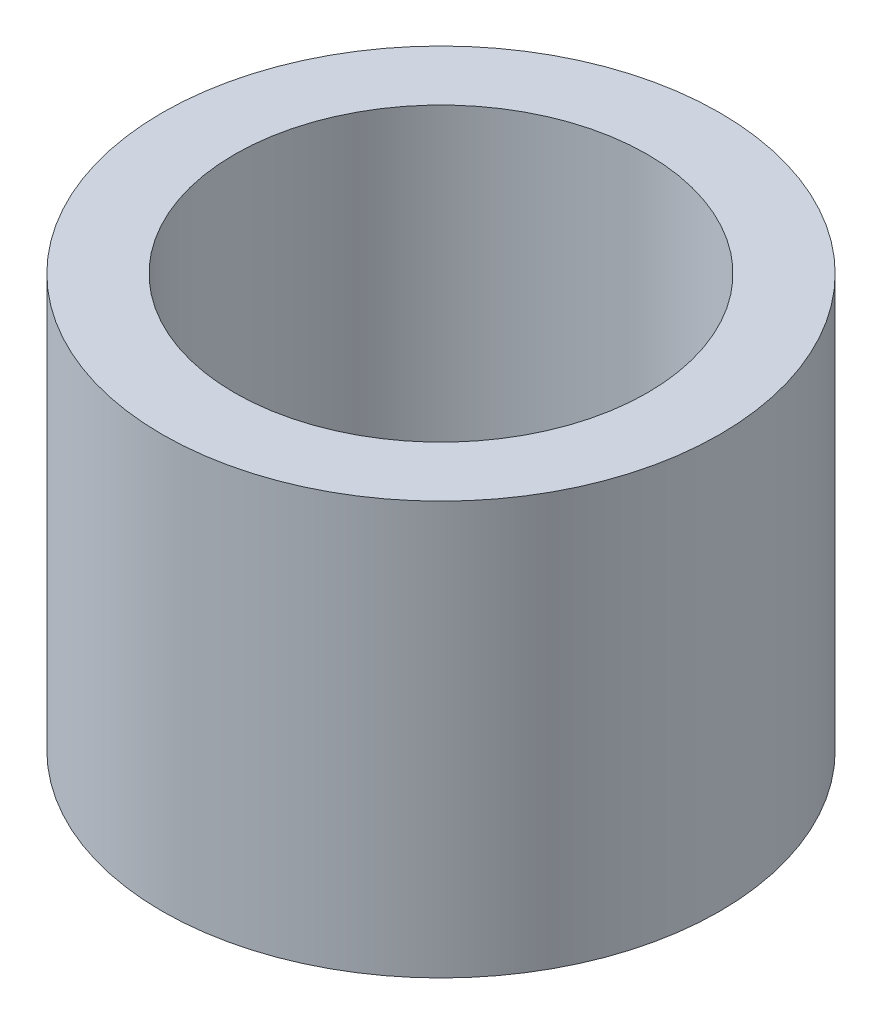
ISO-10303-21;
HEADER;
FILE_DESCRIPTION(('STEP AP214'),'2;1');
FILE_NAME('part.step','',(''),(''),'','','');
FILE_SCHEMA(('AUTOMOTIVE_DESIGN { 1 0 10303 214 1 1 1 1 }'));
ENDSEC;
DATA;
#1=APPLICATION_CONTEXT('core data for automotive mechanical design processes');
#2=APPLICATION_PROTOCOL_DEFINITION('international standard','automotive_design',2000,#1);
#3=PRODUCT_CONTEXT('',#1,'mechanical');
#4=PRODUCT('Part','Part','',(#3));
#5=PRODUCT_RELATED_PRODUCT_CATEGORY('part','',(#4));
#6=PRODUCT_DEFINITION_FORMATION('','',#4);
#7=PRODUCT_DEFINITION_CONTEXT('part definition',#1,'design');
#8=PRODUCT_DEFINITION('design','',#6,#7);
#9=PRODUCT_DEFINITION_SHAPE('','',#8);
#10=(LENGTH_UNIT() NAMED_UNIT(*) SI_UNIT(.MILLI.,.METRE.));
#11=(NAMED_UNIT(*) PLANE_ANGLE_UNIT() SI_UNIT($,.RADIAN.));
#12=(NAMED_UNIT(*) SI_UNIT($,.STERADIAN.) SOLID_ANGLE_UNIT());
#13=UNCERTAINTY_MEASURE_WITH_UNIT(LENGTH_MEASURE(1.E-05),#10,'distance_accuracy_value','');
#14=(GEOMETRIC_REPRESENTATION_CONTEXT(3) GLOBAL_UNCERTAINTY_ASSIGNED_CONTEXT((#13)) GLOBAL_UNIT_ASSIGNED_CONTEXT((#10,
#11,#12)) REPRESENTATION_CONTEXT('',''));
#15=CARTESIAN_POINT('',(0.,0.,0.));
#16=DIRECTION('',(0.,0.,1.));
#17=DIRECTION('',(1.,0.,0.));
#18=AXIS2_PLACEMENT_3D('',#15,#16,#17);
#19=CARTESIAN_POINT('',(0.,2.,0.));
#20=DIRECTION('',(0.,1.,0.));
#21=DIRECTION('',(0.,0.,1.));
#22=AXIS2_PLACEMENT_3D('',#19,#20,#21);
#23=PLANE('',#22);
#24=CARTESIAN_POINT('',(0.,2.,0.));
#25=DIRECTION('',(0.,1.,0.));
#26=DIRECTION('',(0.,0.,1.));
#27=AXIS2_PLACEMENT_3D('',#24,#25,#26);
#28=CIRCLE('',#27,1.35);
#29=CARTESIAN_POINT('',(0.,2.,1.35));
#30=VERTEX_POINT('',#29);
#31=EDGE_CURVE('E10',#30,#30,#28,.T.);
#32=ORIENTED_EDGE('',*,*,#31,.T.);
#33=EDGE_LOOP('',(#32));
#34=FACE_BOUND('',#33,.T.);
#35=CARTESIAN_POINT('',(0.,2.,0.));
#36=DIRECTION('',(0.,1.,0.));
#37=DIRECTION('',(0.,0.,1.));
#38=AXIS2_PLACEMENT_3D('',#35,#36,#37);
#39=CIRCLE('',#38,1.);
#40=CARTESIAN_POINT('',(0.,2.,1.));
#41=VERTEX_POINT('',#40);
#42=EDGE_CURVE('E48',#41,#41,#39,.T.);
#43=ORIENTED_EDGE('',*,*,#42,.F.);
#44=EDGE_LOOP('',(#43));
#45=FACE_BOUND('',#44,.T.);
#46=ADVANCED_FACE('F40',(#34,#45),#23,.T.);
#47=CARTESIAN_POINT('',(0.,0.,0.));
#48=DIRECTION('',(0.,1.,0.));
#49=DIRECTION('',(0.,0.,1.));
#50=AXIS2_PLACEMENT_3D('',#47,#48,#49);
#51=PLANE('',#50);
#52=CARTESIAN_POINT('',(0.,0.,0.));
#53=DIRECTION('',(0.,1.,0.));
#54=DIRECTION('',(0.,0.,1.));
#55=AXIS2_PLACEMENT_3D('',#52,#53,#54);
#56=CIRCLE('',#55,1.35);
#57=CARTESIAN_POINT('',(0.,0.,1.35));
#58=VERTEX_POINT('',#57);
#59=EDGE_CURVE('E41',#58,#58,#56,.T.);
#60=ORIENTED_EDGE('',*,*,#59,.F.);
#61=EDGE_LOOP('',(#60));
#62=FACE_BOUND('',#61,.T.);
#63=CARTESIAN_POINT('',(0.,0.,0.));
#64=DIRECTION('',(0.,1.,0.));
#65=DIRECTION('',(0.,0.,1.));
#66=AXIS2_PLACEMENT_3D('',#63,#64,#65);
#67=CIRCLE('',#66,1.);
#68=CARTESIAN_POINT('',(0.,0.,1.));
#69=VERTEX_POINT('',#68);
#70=EDGE_CURVE('E49',#69,#69,#67,.T.);
#71=ORIENTED_EDGE('',*,*,#70,.T.);
#72=EDGE_LOOP('',(#71));
#73=FACE_BOUND('',#72,.T.);
#74=ADVANCED_FACE('F58',(#62,#73),#51,.F.);
#75=CARTESIAN_POINT('',(0.,2.,0.));
#76=DIRECTION('',(0.,-1.,0.));
#77=DIRECTION('',(0.,0.,-1.));
#78=AXIS2_PLACEMENT_3D('',#75,#76,#77);
#79=CYLINDRICAL_SURFACE('',#78,1.35);
#80=ORIENTED_EDGE('',*,*,#31,.F.);
#81=EDGE_LOOP('',(#80));
#82=FACE_BOUND('',#81,.T.);
#83=ORIENTED_EDGE('',*,*,#59,.T.);
#84=EDGE_LOOP('',(#83));
#85=FACE_BOUND('',#84,.T.);
#86=ADVANCED_FACE('F39',(#82,#85),#79,.T.);
#87=CARTESIAN_POINT('',(0.,2.,0.));
#88=DIRECTION('',(0.,-1.,0.));
#89=DIRECTION('',(0.,0.,-1.));
#90=AXIS2_PLACEMENT_3D('',#87,#88,#89);
#91=CYLINDRICAL_SURFACE('',#90,1.);
#92=ORIENTED_EDGE('',*,*,#42,.T.);
#93=EDGE_LOOP('',(#92));
#94=FACE_BOUND('',#93,.T.);
#95=ORIENTED_EDGE('',*,*,#70,.F.);
#96=EDGE_LOOP('',(#95));
#97=FACE_BOUND('',#96,.T.);
#98=ADVANCED_FACE('F57',(#94,#97),#91,.F.);
#99=CLOSED_SHELL('',(#46,#74,#86,#98));
#100=MANIFOLD_SOLID_BREP('B2',#99);
#101=ADVANCED_BREP_SHAPE_REPRESENTATION('',(#18,#100),#14);
#102=SHAPE_DEFINITION_REPRESENTATION(#9,#101);
ENDSEC;
END-ISO-10303-21;
